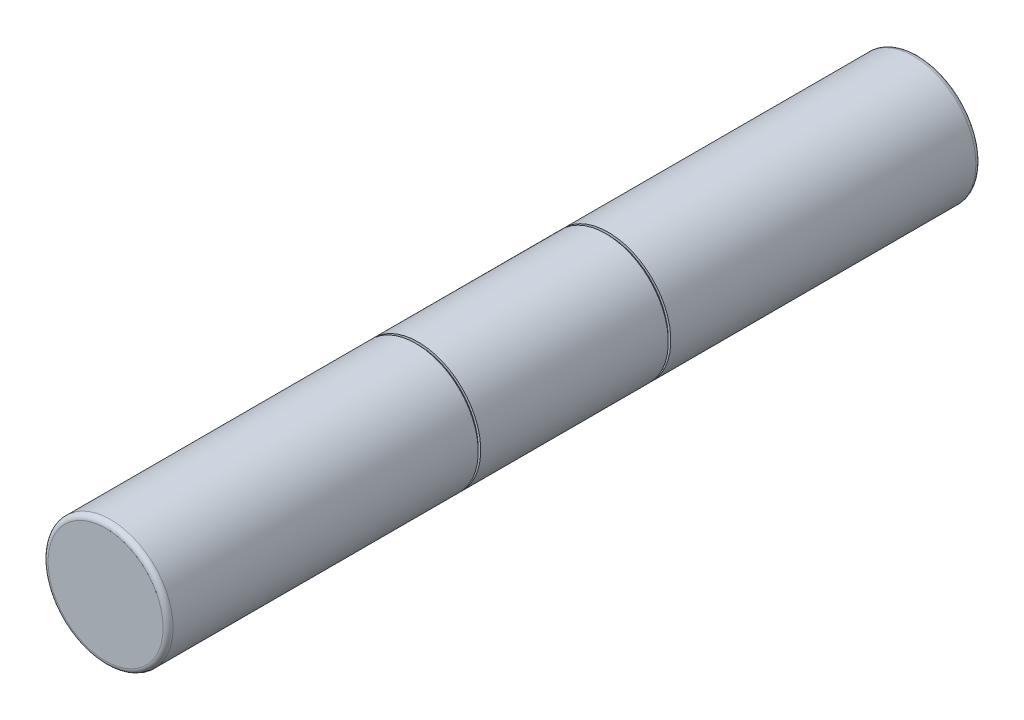
ISO-10303-21;
HEADER;
FILE_DESCRIPTION(('STEP AP214'),'2;1');
FILE_NAME('part.step','',(''),(''),'','','');
FILE_SCHEMA(('AUTOMOTIVE_DESIGN { 1 0 10303 214 1 1 1 1 }'));
ENDSEC;
DATA;
#1=APPLICATION_CONTEXT('core data for automotive mechanical design processes');
#2=APPLICATION_PROTOCOL_DEFINITION('international standard','automotive_design',2000,#1);
#3=PRODUCT_CONTEXT('',#1,'mechanical');
#4=PRODUCT('Part','Part','',(#3));
#5=PRODUCT_RELATED_PRODUCT_CATEGORY('part','',(#4));
#6=PRODUCT_DEFINITION_FORMATION('','',#4);
#7=PRODUCT_DEFINITION_CONTEXT('part definition',#1,'design');
#8=PRODUCT_DEFINITION('design','',#6,#7);
#9=PRODUCT_DEFINITION_SHAPE('','',#8);
#10=(LENGTH_UNIT() NAMED_UNIT(*) SI_UNIT(.MILLI.,.METRE.));
#11=(NAMED_UNIT(*) PLANE_ANGLE_UNIT() SI_UNIT($,.RADIAN.));
#12=(NAMED_UNIT(*) SI_UNIT($,.STERADIAN.) SOLID_ANGLE_UNIT());
#13=UNCERTAINTY_MEASURE_WITH_UNIT(LENGTH_MEASURE(1.E-05),#10,'distance_accuracy_value','');
#14=(GEOMETRIC_REPRESENTATION_CONTEXT(3) GLOBAL_UNCERTAINTY_ASSIGNED_CONTEXT((#13)) GLOBAL_UNIT_ASSIGNED_CONTEXT((#10,
#11,#12)) REPRESENTATION_CONTEXT('',''));
#15=CARTESIAN_POINT('',(0.,0.,0.));
#16=DIRECTION('',(0.,0.,1.));
#17=DIRECTION('',(1.,0.,0.));
#18=AXIS2_PLACEMENT_3D('',#15,#16,#17);
#19=CARTESIAN_POINT('',(0.,0.,20.6375));
#20=DIRECTION('',(0.,0.,-1.));
#21=DIRECTION('',(-1.,0.,0.));
#22=AXIS2_PLACEMENT_3D('',#19,#20,#21);
#23=CYLINDRICAL_SURFACE('',#22,3.175);
#24=CARTESIAN_POINT('',(0.,0.,4.7625));
#25=DIRECTION('',(0.,0.,-1.));
#26=DIRECTION('',(-1.,0.,0.));
#27=AXIS2_PLACEMENT_3D('',#24,#25,#26);
#28=CIRCLE('',#27,3.175);
#29=CARTESIAN_POINT('',(-3.175,0.,4.7625));
#30=VERTEX_POINT('',#29);
#31=EDGE_CURVE('E118',#30,#30,#28,.T.);
#32=ORIENTED_EDGE('',*,*,#31,.T.);
#33=EDGE_LOOP('',(#32));
#34=FACE_BOUND('',#33,.T.);
#35=CARTESIAN_POINT('',(0.,0.,-4.7625));
#36=DIRECTION('',(0.,0.,-1.));
#37=DIRECTION('',(-1.,0.,0.));
#38=AXIS2_PLACEMENT_3D('',#35,#36,#37);
#39=CIRCLE('',#38,3.175);
#40=CARTESIAN_POINT('',(-3.175,0.,-4.7625));
#41=VERTEX_POINT('',#40);
#42=EDGE_CURVE('E105',#41,#41,#39,.T.);
#43=ORIENTED_EDGE('',*,*,#42,.F.);
#44=EDGE_LOOP('',(#43));
#45=FACE_BOUND('',#44,.T.);
#46=ADVANCED_FACE('F85',(#34,#45),#23,.T.);
#47=CARTESIAN_POINT('',(0.,0.,-4.7625));
#48=DIRECTION('',(0.,0.,-1.));
#49=DIRECTION('',(-1.,0.,0.));
#50=AXIS2_PLACEMENT_3D('',#47,#48,#49);
#51=PLANE('',#50);
#52=CARTESIAN_POINT('',(0.,0.,-4.7625));
#53=DIRECTION('',(0.,0.,-1.));
#54=DIRECTION('',(-1.,0.,0.));
#55=AXIS2_PLACEMENT_3D('',#52,#53,#54);
#56=CIRCLE('',#55,3.048);
#57=CARTESIAN_POINT('',(-3.048,0.,-4.7625));
#58=VERTEX_POINT('',#57);
#59=EDGE_CURVE('E109',#58,#58,#56,.T.);
#60=ORIENTED_EDGE('',*,*,#59,.F.);
#61=EDGE_LOOP('',(#60));
#62=FACE_BOUND('',#61,.T.);
#63=ORIENTED_EDGE('',*,*,#42,.T.);
#64=EDGE_LOOP('',(#63));
#65=FACE_BOUND('',#64,.T.);
#66=ADVANCED_FACE('F156',(#62,#65),#51,.T.);
#67=CARTESIAN_POINT('',(0.,0.,-4.8895));
#68=DIRECTION('',(0.,0.,-1.));
#69=DIRECTION('',(-1.,0.,0.));
#70=AXIS2_PLACEMENT_3D('',#67,#68,#69);
#71=PLANE('',#70);
#72=CARTESIAN_POINT('',(0.,0.,-4.8895));
#73=DIRECTION('',(0.,0.,-1.));
#74=DIRECTION('',(-1.,0.,0.));
#75=AXIS2_PLACEMENT_3D('',#72,#73,#74);
#76=CIRCLE('',#75,3.048);
#77=CARTESIAN_POINT('',(-3.048,0.,-4.8895));
#78=VERTEX_POINT('',#77);
#79=EDGE_CURVE('E112',#78,#78,#76,.T.);
#80=ORIENTED_EDGE('',*,*,#79,.T.);
#81=EDGE_LOOP('',(#80));
#82=FACE_BOUND('',#81,.T.);
#83=CARTESIAN_POINT('',(0.,0.,-4.8895));
#84=DIRECTION('',(0.,0.,-1.));
#85=DIRECTION('',(-1.,0.,0.));
#86=AXIS2_PLACEMENT_3D('',#83,#84,#85);
#87=CIRCLE('',#86,3.175);
#88=CARTESIAN_POINT('',(-3.175,0.,-4.8895));
#89=VERTEX_POINT('',#88);
#90=EDGE_CURVE('E106',#89,#89,#87,.T.);
#91=ORIENTED_EDGE('',*,*,#90,.F.);
#92=EDGE_LOOP('',(#91));
#93=FACE_BOUND('',#92,.T.);
#94=ADVANCED_FACE('F167',(#82,#93),#71,.F.);
#95=CARTESIAN_POINT('',(0.,0.,-4.7625));
#96=DIRECTION('',(0.,0.,-1.));
#97=DIRECTION('',(-1.,0.,0.));
#98=AXIS2_PLACEMENT_3D('',#95,#96,#97);
#99=CYLINDRICAL_SURFACE('',#98,3.048);
#100=ORIENTED_EDGE('',*,*,#59,.T.);
#101=EDGE_LOOP('',(#100));
#102=FACE_BOUND('',#101,.T.);
#103=ORIENTED_EDGE('',*,*,#79,.F.);
#104=EDGE_LOOP('',(#103));
#105=FACE_BOUND('',#104,.T.);
#106=ADVANCED_FACE('F163',(#102,#105),#99,.T.);
#107=CARTESIAN_POINT('',(0.,0.,-20.6375));
#108=DIRECTION('',(0.,0.,1.));
#109=DIRECTION('',(1.,0.,0.));
#110=AXIS2_PLACEMENT_3D('',#107,#108,#109);
#111=PLANE('',#110);
#112=CARTESIAN_POINT('',(0.,0.,-20.6375));
#113=DIRECTION('',(0.,0.,1.));
#114=DIRECTION('',(1.,0.,0.));
#115=AXIS2_PLACEMENT_3D('',#112,#113,#114);
#116=CIRCLE('',#115,2.921);
#117=CARTESIAN_POINT('',(2.921,0.,-20.6375));
#118=VERTEX_POINT('',#117);
#119=EDGE_CURVE('E11',#118,#118,#116,.F.);
#120=ORIENTED_EDGE('',*,*,#119,.T.);
#121=EDGE_LOOP('',(#120));
#122=FACE_BOUND('',#121,.T.);
#123=ADVANCED_FACE('F159',(#122),#111,.F.);
#124=CARTESIAN_POINT('',(0.,0.,-20.3835));
#125=DIRECTION('',(0.,0.,1.));
#126=DIRECTION('',(1.,0.,0.));
#127=AXIS2_PLACEMENT_3D('',#124,#125,#126);
#128=CIRCLE('',#127,3.175);
#129=CARTESIAN_POINT('',(3.175,0.,-20.3835));
#130=VERTEX_POINT('',#129);
#131=EDGE_CURVE('E92',#130,#130,#128,.T.);
#132=ORIENTED_EDGE('',*,*,#131,.T.);
#133=EDGE_LOOP('',(#132));
#134=FACE_BOUND('',#133,.T.);
#135=ORIENTED_EDGE('',*,*,#90,.T.);
#136=EDGE_LOOP('',(#135));
#137=FACE_BOUND('',#136,.T.);
#138=ADVANCED_FACE('F137',(#134,#137),#23,.T.);
#139=CARTESIAN_POINT('',(0.,0.,4.8895));
#140=DIRECTION('',(0.,0.,-1.));
#141=DIRECTION('',(-1.,0.,0.));
#142=AXIS2_PLACEMENT_3D('',#139,#140,#141);
#143=PLANE('',#142);
#144=CARTESIAN_POINT('',(0.,0.,4.8895));
#145=DIRECTION('',(0.,0.,-1.));
#146=DIRECTION('',(-1.,0.,0.));
#147=AXIS2_PLACEMENT_3D('',#144,#145,#146);
#148=CIRCLE('',#147,3.048);
#149=CARTESIAN_POINT('',(-3.048,0.,4.8895));
#150=VERTEX_POINT('',#149);
#151=EDGE_CURVE('E121',#150,#150,#148,.T.);
#152=ORIENTED_EDGE('',*,*,#151,.F.);
#153=EDGE_LOOP('',(#152));
#154=FACE_BOUND('',#153,.T.);
#155=CARTESIAN_POINT('',(0.,0.,4.8895));
#156=DIRECTION('',(0.,0.,-1.));
#157=DIRECTION('',(-1.,0.,0.));
#158=AXIS2_PLACEMENT_3D('',#155,#156,#157);
#159=CIRCLE('',#158,3.175);
#160=CARTESIAN_POINT('',(-3.175,0.,4.8895));
#161=VERTEX_POINT('',#160);
#162=EDGE_CURVE('E115',#161,#161,#159,.T.);
#163=ORIENTED_EDGE('',*,*,#162,.T.);
#164=EDGE_LOOP('',(#163));
#165=FACE_BOUND('',#164,.T.);
#166=ADVANCED_FACE('F133',(#154,#165),#143,.T.);
#167=CARTESIAN_POINT('',(0.,0.,4.7625));
#168=DIRECTION('',(0.,0.,-1.));
#169=DIRECTION('',(-1.,0.,0.));
#170=AXIS2_PLACEMENT_3D('',#167,#168,#169);
#171=PLANE('',#170);
#172=CARTESIAN_POINT('',(0.,0.,4.7625));
#173=DIRECTION('',(0.,0.,-1.));
#174=DIRECTION('',(-1.,0.,0.));
#175=AXIS2_PLACEMENT_3D('',#172,#173,#174);
#176=CIRCLE('',#175,3.048);
#177=CARTESIAN_POINT('',(-3.048,0.,4.7625));
#178=VERTEX_POINT('',#177);
#179=EDGE_CURVE('E124',#178,#178,#176,.T.);
#180=ORIENTED_EDGE('',*,*,#179,.T.);
#181=EDGE_LOOP('',(#180));
#182=FACE_BOUND('',#181,.T.);
#183=ORIENTED_EDGE('',*,*,#31,.F.);
#184=EDGE_LOOP('',(#183));
#185=FACE_BOUND('',#184,.T.);
#186=ADVANCED_FACE('F136',(#182,#185),#171,.F.);
#187=CARTESIAN_POINT('',(0.,0.,4.8895));
#188=DIRECTION('',(0.,0.,-1.));
#189=DIRECTION('',(-1.,0.,0.));
#190=AXIS2_PLACEMENT_3D('',#187,#188,#189);
#191=CYLINDRICAL_SURFACE('',#190,3.048);
#192=ORIENTED_EDGE('',*,*,#151,.T.);
#193=EDGE_LOOP('',(#192));
#194=FACE_BOUND('',#193,.T.);
#195=ORIENTED_EDGE('',*,*,#179,.F.);
#196=EDGE_LOOP('',(#195));
#197=FACE_BOUND('',#196,.T.);
#198=ADVANCED_FACE('F130',(#194,#197),#191,.T.);
#199=CARTESIAN_POINT('',(0.,0.,20.6375));
#200=DIRECTION('',(0.,0.,1.));
#201=DIRECTION('',(1.,0.,0.));
#202=AXIS2_PLACEMENT_3D('',#199,#200,#201);
#203=PLANE('',#202);
#204=CARTESIAN_POINT('',(0.,0.,20.6375));
#205=DIRECTION('',(0.,0.,1.));
#206=DIRECTION('',(1.,0.,0.));
#207=AXIS2_PLACEMENT_3D('',#204,#205,#206);
#208=CIRCLE('',#207,2.921);
#209=CARTESIAN_POINT('',(2.921,0.,20.6375));
#210=VERTEX_POINT('',#209);
#211=EDGE_CURVE('E100',#210,#210,#208,.T.);
#212=ORIENTED_EDGE('',*,*,#211,.T.);
#213=EDGE_LOOP('',(#212));
#214=FACE_BOUND('',#213,.T.);
#215=ADVANCED_FACE('F144',(#214),#203,.T.);
#216=CARTESIAN_POINT('',(0.,0.,20.3835));
#217=DIRECTION('',(0.,0.,1.));
#218=DIRECTION('',(1.,0.,0.));
#219=AXIS2_PLACEMENT_3D('',#216,#217,#218);
#220=CIRCLE('',#219,3.175);
#221=CARTESIAN_POINT('',(3.175,0.,20.3835));
#222=VERTEX_POINT('',#221);
#223=EDGE_CURVE('E96',#222,#222,#220,.F.);
#224=ORIENTED_EDGE('',*,*,#223,.T.);
#225=EDGE_LOOP('',(#224));
#226=FACE_BOUND('',#225,.T.);
#227=ORIENTED_EDGE('',*,*,#162,.F.);
#228=EDGE_LOOP('',(#227));
#229=FACE_BOUND('',#228,.T.);
#230=ADVANCED_FACE('F141',(#226,#229),#23,.T.);
#231=CARTESIAN_POINT('',(0.,0.,20.3835));
#232=DIRECTION('',(0.,0.,1.));
#233=DIRECTION('',(1.,0.,0.));
#234=AXIS2_PLACEMENT_3D('',#231,#232,#233);
#235=TOROIDAL_SURFACE('',#234,2.921,0.254);
#236=ORIENTED_EDGE('',*,*,#223,.F.);
#237=EDGE_LOOP('',(#236));
#238=FACE_BOUND('',#237,.T.);
#239=ORIENTED_EDGE('',*,*,#211,.F.);
#240=EDGE_LOOP('',(#239));
#241=FACE_BOUND('',#240,.T.);
#242=ADVANCED_FACE('F143',(#238,#241),#235,.T.);
#243=CARTESIAN_POINT('',(0.,0.,-20.3835));
#244=DIRECTION('',(0.,0.,1.));
#245=DIRECTION('',(1.,0.,0.));
#246=AXIS2_PLACEMENT_3D('',#243,#244,#245);
#247=TOROIDAL_SURFACE('',#246,2.921,0.254);
#248=ORIENTED_EDGE('',*,*,#119,.F.);
#249=EDGE_LOOP('',(#248));
#250=FACE_BOUND('',#249,.T.);
#251=ORIENTED_EDGE('',*,*,#131,.F.);
#252=EDGE_LOOP('',(#251));
#253=FACE_BOUND('',#252,.T.);
#254=ADVANCED_FACE('F87',(#250,#253),#247,.T.);
#255=CLOSED_SHELL('',(#46,#66,#94,#106,#123,#138,#166,#186,#198,#215,#230,#242,#254));
#256=MANIFOLD_SOLID_BREP('B2',#255);
#257=ADVANCED_BREP_SHAPE_REPRESENTATION('',(#18,#256),#14);
#258=SHAPE_DEFINITION_REPRESENTATION(#9,#257);
ENDSEC;
END-ISO-10303-21;
